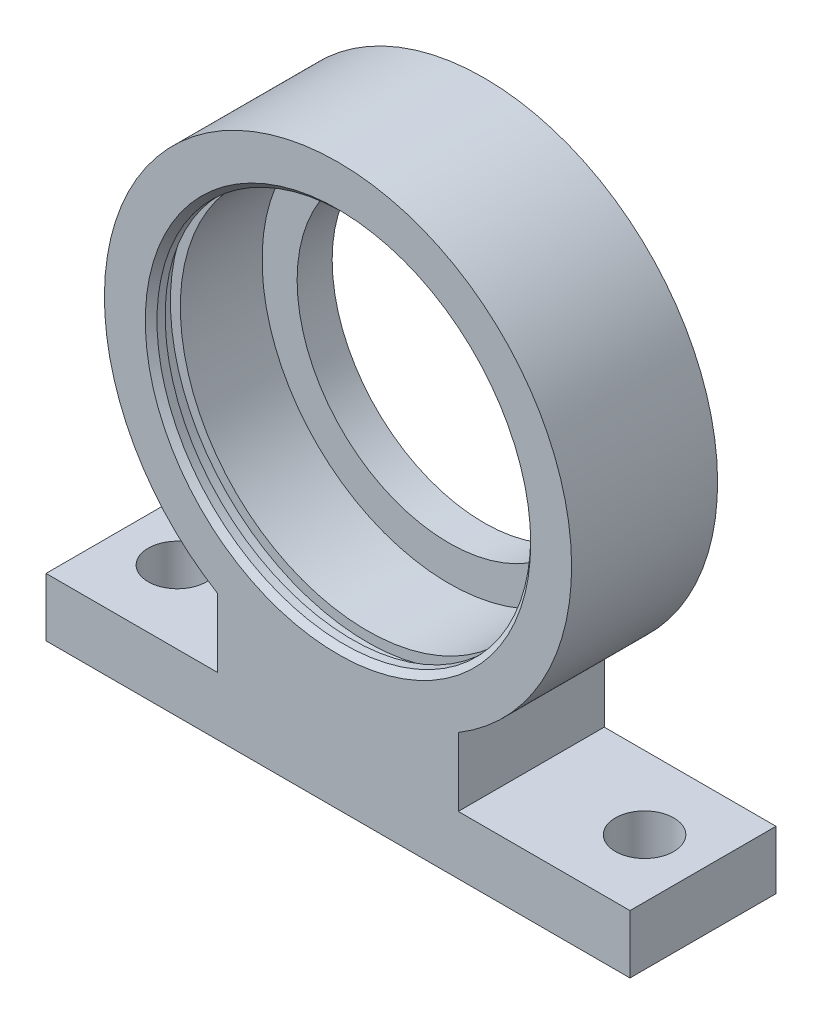
ISO-10303-21;
HEADER;
FILE_DESCRIPTION(('STEP AP214'),'2;1');
FILE_NAME('part.step','',(''),(''),'','','');
FILE_SCHEMA(('AUTOMOTIVE_DESIGN { 1 0 10303 214 1 1 1 1 }'));
ENDSEC;
DATA;
#1=APPLICATION_CONTEXT('core data for automotive mechanical design processes');
#2=APPLICATION_PROTOCOL_DEFINITION('international standard','automotive_design',2000,#1);
#3=PRODUCT_CONTEXT('',#1,'mechanical');
#4=PRODUCT('Part','Part','',(#3));
#5=PRODUCT_RELATED_PRODUCT_CATEGORY('part','',(#4));
#6=PRODUCT_DEFINITION_FORMATION('','',#4);
#7=PRODUCT_DEFINITION_CONTEXT('part definition',#1,'design');
#8=PRODUCT_DEFINITION('design','',#6,#7);
#9=PRODUCT_DEFINITION_SHAPE('','',#8);
#10=(LENGTH_UNIT() NAMED_UNIT(*) SI_UNIT(.MILLI.,.METRE.));
#11=(NAMED_UNIT(*) PLANE_ANGLE_UNIT() SI_UNIT($,.RADIAN.));
#12=(NAMED_UNIT(*) SI_UNIT($,.STERADIAN.) SOLID_ANGLE_UNIT());
#13=UNCERTAINTY_MEASURE_WITH_UNIT(LENGTH_MEASURE(1.E-05),#10,'distance_accuracy_value','');
#14=(GEOMETRIC_REPRESENTATION_CONTEXT(3) GLOBAL_UNCERTAINTY_ASSIGNED_CONTEXT((#13)) GLOBAL_UNIT_ASSIGNED_CONTEXT((#10,
#11,#12)) REPRESENTATION_CONTEXT('',''));
#15=CARTESIAN_POINT('',(0.,0.,0.));
#16=DIRECTION('',(0.,0.,1.));
#17=DIRECTION('',(1.,0.,0.));
#18=AXIS2_PLACEMENT_3D('',#15,#16,#17);
#19=CARTESIAN_POINT('',(0.,0.,12.5));
#20=DIRECTION('',(0.,0.,-1.));
#21=DIRECTION('',(-1.,0.,0.));
#22=AXIS2_PLACEMENT_3D('',#19,#20,#21);
#23=CYLINDRICAL_SURFACE('',#22,16.);
#24=CARTESIAN_POINT('',(0.,0.,3.));
#25=DIRECTION('',(0.,0.,1.));
#26=DIRECTION('',(1.,0.,0.));
#27=AXIS2_PLACEMENT_3D('',#24,#25,#26);
#28=CIRCLE('',#27,16.);
#29=CARTESIAN_POINT('',(16.,0.,3.));
#30=VERTEX_POINT('',#29);
#31=EDGE_CURVE('E165',#30,#30,#28,.T.);
#32=ORIENTED_EDGE('',*,*,#31,.F.);
#33=EDGE_LOOP('',(#32));
#34=FACE_BOUND('',#33,.T.);
#35=CARTESIAN_POINT('',(0.,0.,10.));
#36=DIRECTION('',(0.,0.,1.));
#37=DIRECTION('',(1.,0.,0.));
#38=AXIS2_PLACEMENT_3D('',#35,#36,#37);
#39=CIRCLE('',#38,16.);
#40=CARTESIAN_POINT('',(16.,0.,10.));
#41=VERTEX_POINT('',#40);
#42=EDGE_CURVE('E278',#41,#41,#39,.T.);
#43=ORIENTED_EDGE('',*,*,#42,.T.);
#44=EDGE_LOOP('',(#43));
#45=FACE_BOUND('',#44,.T.);
#46=ADVANCED_FACE('F35',(#34,#45),#23,.F.);
#47=CARTESIAN_POINT('',(0.,0.,12.5));
#48=DIRECTION('',(0.,0.,-1.));
#49=DIRECTION('',(-1.,0.,0.));
#50=AXIS2_PLACEMENT_3D('',#47,#48,#49);
#51=CYLINDRICAL_SURFACE('',#50,13.);
#52=CARTESIAN_POINT('',(0.,0.,0.));
#53=DIRECTION('',(0.,0.,1.));
#54=DIRECTION('',(1.,0.,0.));
#55=AXIS2_PLACEMENT_3D('',#52,#53,#54);
#56=CIRCLE('',#55,13.);
#57=CARTESIAN_POINT('',(13.,0.,0.));
#58=VERTEX_POINT('',#57);
#59=EDGE_CURVE('E137',#58,#58,#56,.T.);
#60=ORIENTED_EDGE('',*,*,#59,.F.);
#61=EDGE_LOOP('',(#60));
#62=FACE_BOUND('',#61,.T.);
#63=CARTESIAN_POINT('',(0.,0.,3.));
#64=DIRECTION('',(0.,0.,1.));
#65=DIRECTION('',(1.,0.,0.));
#66=AXIS2_PLACEMENT_3D('',#63,#64,#65);
#67=CIRCLE('',#66,13.);
#68=CARTESIAN_POINT('',(13.,0.,3.));
#69=VERTEX_POINT('',#68);
#70=EDGE_CURVE('E163',#69,#69,#67,.T.);
#71=ORIENTED_EDGE('',*,*,#70,.T.);
#72=EDGE_LOOP('',(#71));
#73=FACE_BOUND('',#72,.T.);
#74=ADVANCED_FACE('F183',(#62,#73),#51,.F.);
#75=CARTESIAN_POINT('',(0.,0.,12.5));
#76=DIRECTION('',(0.,0.,1.));
#77=DIRECTION('',(1.,0.,0.));
#78=AXIS2_PLACEMENT_3D('',#75,#76,#77);
#79=PLANE('',#78);
#80=CARTESIAN_POINT('',(0.,0.,12.5));
#81=DIRECTION('',(0.,0.,1.));
#82=DIRECTION('',(1.,0.,0.));
#83=AXIS2_PLACEMENT_3D('',#80,#81,#82);
#84=CIRCLE('',#83,16.5);
#85=CARTESIAN_POINT('',(16.5,0.,12.5));
#86=VERTEX_POINT('',#85);
#87=EDGE_CURVE('E11',#86,#86,#84,.F.);
#88=ORIENTED_EDGE('',*,*,#87,.T.);
#89=EDGE_LOOP('',(#88));
#90=FACE_BOUND('',#89,.T.);
#91=DIRECTION('',(0.,1.,0.));
#92=VECTOR('',#91,1.);
#93=CARTESIAN_POINT('',(25.,-28.,12.5));
#94=LINE('',#93,#92);
#95=CARTESIAN_POINT('',(25.,-28.,12.5));
#96=VERTEX_POINT('',#95);
#97=CARTESIAN_POINT('',(25.,-23.,12.5));
#98=VERTEX_POINT('',#97);
#99=EDGE_CURVE('E148',#96,#98,#94,.T.);
#100=ORIENTED_EDGE('',*,*,#99,.T.);
#101=DIRECTION('',(-1.,0.,0.));
#102=VECTOR('',#101,1.);
#103=CARTESIAN_POINT('',(25.,-23.,12.5));
#104=LINE('',#103,#102);
#105=CARTESIAN_POINT('',(10.2978420208395,-23.,12.5));
#106=VERTEX_POINT('',#105);
#107=EDGE_CURVE('E96',#98,#106,#104,.T.);
#108=ORIENTED_EDGE('',*,*,#107,.T.);
#109=DIRECTION('',(0.,1.,0.));
#110=VECTOR('',#109,1.);
#111=CARTESIAN_POINT('',(10.2978420208395,-23.,12.5));
#112=LINE('',#111,#110);
#113=CARTESIAN_POINT('',(10.2978420208395,-17.1450998747115,12.5));
#114=VERTEX_POINT('',#113);
#115=EDGE_CURVE('E248',#106,#114,#112,.T.);
#116=ORIENTED_EDGE('',*,*,#115,.T.);
#117=CARTESIAN_POINT('',(0.,0.,12.5));
#118=DIRECTION('',(0.,0.,1.));
#119=DIRECTION('',(1.,0.,0.));
#120=AXIS2_PLACEMENT_3D('',#117,#118,#119);
#121=CIRCLE('',#120,20.);
#122=CARTESIAN_POINT('',(-10.2978420208395,-17.1450998747115,12.5));
#123=VERTEX_POINT('',#122);
#124=EDGE_CURVE('E250',#114,#123,#121,.T.);
#125=ORIENTED_EDGE('',*,*,#124,.T.);
#126=DIRECTION('',(0.,-1.,0.));
#127=VECTOR('',#126,1.);
#128=CARTESIAN_POINT('',(-10.2978420208395,-23.,12.5));
#129=LINE('',#128,#127);
#130=CARTESIAN_POINT('',(-10.2978420208395,-23.,12.5));
#131=VERTEX_POINT('',#130);
#132=EDGE_CURVE('E115',#123,#131,#129,.T.);
#133=ORIENTED_EDGE('',*,*,#132,.T.);
#134=DIRECTION('',(-1.,0.,0.));
#135=VECTOR('',#134,1.);
#136=CARTESIAN_POINT('',(-25.,-23.,12.5));
#137=LINE('',#136,#135);
#138=CARTESIAN_POINT('',(-25.,-23.,12.5));
#139=VERTEX_POINT('',#138);
#140=EDGE_CURVE('E109',#131,#139,#137,.T.);
#141=ORIENTED_EDGE('',*,*,#140,.T.);
#142=DIRECTION('',(0.,-1.,0.));
#143=VECTOR('',#142,1.);
#144=CARTESIAN_POINT('',(-25.,-28.,12.5));
#145=LINE('',#144,#143);
#146=CARTESIAN_POINT('',(-25.,-28.,12.5));
#147=VERTEX_POINT('',#146);
#148=EDGE_CURVE('E113',#139,#147,#145,.T.);
#149=ORIENTED_EDGE('',*,*,#148,.T.);
#150=DIRECTION('',(1.,0.,0.));
#151=VECTOR('',#150,1.);
#152=CARTESIAN_POINT('',(25.,-28.,12.5));
#153=LINE('',#152,#151);
#154=EDGE_CURVE('E52',#147,#96,#153,.T.);
#155=ORIENTED_EDGE('',*,*,#154,.T.);
#156=EDGE_LOOP('',(#100,#108,#116,#125,#133,#141,#149,#155));
#157=FACE_BOUND('',#156,.T.);
#158=ADVANCED_FACE('F111',(#90,#157),#79,.T.);
#159=CARTESIAN_POINT('',(0.,0.,0.));
#160=DIRECTION('',(0.,0.,1.));
#161=DIRECTION('',(1.,0.,0.));
#162=AXIS2_PLACEMENT_3D('',#159,#160,#161);
#163=PLANE('',#162);
#164=DIRECTION('',(0.,1.,0.));
#165=VECTOR('',#164,1.);
#166=CARTESIAN_POINT('',(25.,-28.,0.));
#167=LINE('',#166,#165);
#168=CARTESIAN_POINT('',(25.,-28.,0.));
#169=VERTEX_POINT('',#168);
#170=CARTESIAN_POINT('',(25.,-23.,0.));
#171=VERTEX_POINT('',#170);
#172=EDGE_CURVE('E133',#169,#171,#167,.T.);
#173=ORIENTED_EDGE('',*,*,#172,.F.);
#174=DIRECTION('',(1.,0.,0.));
#175=VECTOR('',#174,1.);
#176=CARTESIAN_POINT('',(25.,-28.,0.));
#177=LINE('',#176,#175);
#178=CARTESIAN_POINT('',(-25.,-28.,0.));
#179=VERTEX_POINT('',#178);
#180=EDGE_CURVE('E87',#179,#169,#177,.T.);
#181=ORIENTED_EDGE('',*,*,#180,.F.);
#182=DIRECTION('',(0.,-1.,0.));
#183=VECTOR('',#182,1.);
#184=CARTESIAN_POINT('',(-25.,-28.,0.));
#185=LINE('',#184,#183);
#186=CARTESIAN_POINT('',(-25.,-23.,0.));
#187=VERTEX_POINT('',#186);
#188=EDGE_CURVE('E81',#187,#179,#185,.T.);
#189=ORIENTED_EDGE('',*,*,#188,.F.);
#190=DIRECTION('',(-1.,0.,0.));
#191=VECTOR('',#190,1.);
#192=CARTESIAN_POINT('',(-25.,-23.,0.));
#193=LINE('',#192,#191);
#194=CARTESIAN_POINT('',(-10.2978420208395,-23.,0.));
#195=VERTEX_POINT('',#194);
#196=EDGE_CURVE('E123',#195,#187,#193,.T.);
#197=ORIENTED_EDGE('',*,*,#196,.F.);
#198=DIRECTION('',(0.,-1.,0.));
#199=VECTOR('',#198,1.);
#200=CARTESIAN_POINT('',(-10.2978420208395,-23.,0.));
#201=LINE('',#200,#199);
#202=CARTESIAN_POINT('',(-10.2978420208395,-17.1450998747115,0.));
#203=VERTEX_POINT('',#202);
#204=EDGE_CURVE('E143',#203,#195,#201,.T.);
#205=ORIENTED_EDGE('',*,*,#204,.F.);
#206=CARTESIAN_POINT('',(0.,0.,0.));
#207=DIRECTION('',(0.,0.,1.));
#208=DIRECTION('',(1.,0.,0.));
#209=AXIS2_PLACEMENT_3D('',#206,#207,#208);
#210=CIRCLE('',#209,20.);
#211=CARTESIAN_POINT('',(10.2978420208395,-17.1450998747115,0.));
#212=VERTEX_POINT('',#211);
#213=EDGE_CURVE('E141',#212,#203,#210,.T.);
#214=ORIENTED_EDGE('',*,*,#213,.F.);
#215=DIRECTION('',(0.,1.,0.));
#216=VECTOR('',#215,1.);
#217=CARTESIAN_POINT('',(10.2978420208395,-23.,0.));
#218=LINE('',#217,#216);
#219=CARTESIAN_POINT('',(10.2978420208395,-23.,0.));
#220=VERTEX_POINT('',#219);
#221=EDGE_CURVE('E139',#220,#212,#218,.T.);
#222=ORIENTED_EDGE('',*,*,#221,.F.);
#223=DIRECTION('',(-1.,0.,0.));
#224=VECTOR('',#223,1.);
#225=CARTESIAN_POINT('',(25.,-23.,0.));
#226=LINE('',#225,#224);
#227=EDGE_CURVE('E136',#171,#220,#226,.T.);
#228=ORIENTED_EDGE('',*,*,#227,.F.);
#229=EDGE_LOOP('',(#173,#181,#189,#197,#205,#214,#222,#228));
#230=FACE_BOUND('',#229,.T.);
#231=ORIENTED_EDGE('',*,*,#59,.T.);
#232=EDGE_LOOP('',(#231));
#233=FACE_BOUND('',#232,.T.);
#234=ADVANCED_FACE('F212',(#230,#233),#163,.F.);
#235=CARTESIAN_POINT('',(25.,-28.,12.5));
#236=DIRECTION('',(-1.,0.,0.));
#237=DIRECTION('',(0.,-1.,0.));
#238=AXIS2_PLACEMENT_3D('',#235,#236,#237);
#239=PLANE('',#238);
#240=ORIENTED_EDGE('',*,*,#172,.T.);
#241=DIRECTION('',(0.,0.,-1.));
#242=VECTOR('',#241,1.);
#243=CARTESIAN_POINT('',(25.,-23.,12.5));
#244=LINE('',#243,#242);
#245=EDGE_CURVE('E161',#98,#171,#244,.T.);
#246=ORIENTED_EDGE('',*,*,#245,.F.);
#247=ORIENTED_EDGE('',*,*,#99,.F.);
#248=DIRECTION('',(0.,0.,-1.));
#249=VECTOR('',#248,1.);
#250=CARTESIAN_POINT('',(25.,-28.,12.5));
#251=LINE('',#250,#249);
#252=EDGE_CURVE('E129',#96,#169,#251,.T.);
#253=ORIENTED_EDGE('',*,*,#252,.T.);
#254=EDGE_LOOP('',(#240,#246,#247,#253));
#255=FACE_BOUND('',#254,.T.);
#256=ADVANCED_FACE('F232',(#255),#239,.F.);
#257=CARTESIAN_POINT('',(25.,-23.,12.5));
#258=DIRECTION('',(0.,-1.,0.));
#259=DIRECTION('',(1.,0.,0.));
#260=AXIS2_PLACEMENT_3D('',#257,#258,#259);
#261=PLANE('',#260);
#262=CARTESIAN_POINT('',(20.,-23.,6.25));
#263=DIRECTION('',(0.,1.,0.));
#264=DIRECTION('',(1.,0.,0.));
#265=AXIS2_PLACEMENT_3D('',#262,#263,#264);
#266=CIRCLE('',#265,2.5);
#267=CARTESIAN_POINT('',(17.5,-23.,6.25));
#268=VERTEX_POINT('',#267);
#269=EDGE_CURVE('E261',#268,#268,#266,.T.);
#270=ORIENTED_EDGE('',*,*,#269,.F.);
#271=EDGE_LOOP('',(#270));
#272=FACE_BOUND('',#271,.T.);
#273=ORIENTED_EDGE('',*,*,#227,.T.);
#274=DIRECTION('',(0.,0.,-1.));
#275=VECTOR('',#274,1.);
#276=CARTESIAN_POINT('',(10.2978420208395,-23.,12.5));
#277=LINE('',#276,#275);
#278=EDGE_CURVE('E158',#106,#220,#277,.T.);
#279=ORIENTED_EDGE('',*,*,#278,.F.);
#280=ORIENTED_EDGE('',*,*,#107,.F.);
#281=ORIENTED_EDGE('',*,*,#245,.T.);
#282=EDGE_LOOP('',(#273,#279,#280,#281));
#283=FACE_BOUND('',#282,.T.);
#284=ADVANCED_FACE('F229',(#272,#283),#261,.F.);
#285=CARTESIAN_POINT('',(10.2978420208395,-23.,12.5));
#286=DIRECTION('',(-1.,0.,0.));
#287=DIRECTION('',(0.,0.,1.));
#288=AXIS2_PLACEMENT_3D('',#285,#286,#287);
#289=PLANE('',#288);
#290=ORIENTED_EDGE('',*,*,#221,.T.);
#291=DIRECTION('',(0.,0.,-1.));
#292=VECTOR('',#291,1.);
#293=CARTESIAN_POINT('',(10.2978420208395,-17.1450998747115,12.5));
#294=LINE('',#293,#292);
#295=EDGE_CURVE('E155',#114,#212,#294,.T.);
#296=ORIENTED_EDGE('',*,*,#295,.F.);
#297=ORIENTED_EDGE('',*,*,#115,.F.);
#298=ORIENTED_EDGE('',*,*,#278,.T.);
#299=EDGE_LOOP('',(#290,#296,#297,#298));
#300=FACE_BOUND('',#299,.T.);
#301=ADVANCED_FACE('F225',(#300),#289,.F.);
#302=CARTESIAN_POINT('',(0.,0.,12.5));
#303=DIRECTION('',(0.,0.,-1.));
#304=DIRECTION('',(-1.,0.,0.));
#305=AXIS2_PLACEMENT_3D('',#302,#303,#304);
#306=CYLINDRICAL_SURFACE('',#305,20.);
#307=ORIENTED_EDGE('',*,*,#213,.T.);
#308=DIRECTION('',(0.,0.,-1.));
#309=VECTOR('',#308,1.);
#310=CARTESIAN_POINT('',(-10.2978420208395,-17.1450998747115,12.5));
#311=LINE('',#310,#309);
#312=EDGE_CURVE('E152',#123,#203,#311,.T.);
#313=ORIENTED_EDGE('',*,*,#312,.F.);
#314=ORIENTED_EDGE('',*,*,#124,.F.);
#315=ORIENTED_EDGE('',*,*,#295,.T.);
#316=EDGE_LOOP('',(#307,#313,#314,#315));
#317=FACE_BOUND('',#316,.T.);
#318=ADVANCED_FACE('F221',(#317),#306,.T.);
#319=CARTESIAN_POINT('',(-10.2978420208395,-23.,12.5));
#320=DIRECTION('',(1.,0.,0.));
#321=DIRECTION('',(0.,1.,0.));
#322=AXIS2_PLACEMENT_3D('',#319,#320,#321);
#323=PLANE('',#322);
#324=ORIENTED_EDGE('',*,*,#204,.T.);
#325=DIRECTION('',(0.,0.,-1.));
#326=VECTOR('',#325,1.);
#327=CARTESIAN_POINT('',(-10.2978420208395,-23.,12.5));
#328=LINE('',#327,#326);
#329=EDGE_CURVE('E124',#131,#195,#328,.T.);
#330=ORIENTED_EDGE('',*,*,#329,.F.);
#331=ORIENTED_EDGE('',*,*,#132,.F.);
#332=ORIENTED_EDGE('',*,*,#312,.T.);
#333=EDGE_LOOP('',(#324,#330,#331,#332));
#334=FACE_BOUND('',#333,.T.);
#335=ADVANCED_FACE('F217',(#334),#323,.F.);
#336=CARTESIAN_POINT('',(-25.,-23.,12.5));
#337=DIRECTION('',(0.,-1.,0.));
#338=DIRECTION('',(1.,0.,0.));
#339=AXIS2_PLACEMENT_3D('',#336,#337,#338);
#340=PLANE('',#339);
#341=CARTESIAN_POINT('',(-20.,-23.,6.25));
#342=DIRECTION('',(0.,1.,0.));
#343=DIRECTION('',(-1.,0.,0.));
#344=AXIS2_PLACEMENT_3D('',#341,#342,#343);
#345=CIRCLE('',#344,2.5);
#346=CARTESIAN_POINT('',(-22.5,-23.,6.25));
#347=VERTEX_POINT('',#346);
#348=EDGE_CURVE('E268',#347,#347,#345,.T.);
#349=ORIENTED_EDGE('',*,*,#348,.F.);
#350=EDGE_LOOP('',(#349));
#351=FACE_BOUND('',#350,.T.);
#352=ORIENTED_EDGE('',*,*,#196,.T.);
#353=DIRECTION('',(0.,0.,-1.));
#354=VECTOR('',#353,1.);
#355=CARTESIAN_POINT('',(-25.,-23.,12.5));
#356=LINE('',#355,#354);
#357=EDGE_CURVE('E120',#139,#187,#356,.T.);
#358=ORIENTED_EDGE('',*,*,#357,.F.);
#359=ORIENTED_EDGE('',*,*,#140,.F.);
#360=ORIENTED_EDGE('',*,*,#329,.T.);
#361=EDGE_LOOP('',(#352,#358,#359,#360));
#362=FACE_BOUND('',#361,.T.);
#363=ADVANCED_FACE('F121',(#351,#362),#340,.F.);
#364=CARTESIAN_POINT('',(-25.,-28.,12.5));
#365=DIRECTION('',(1.,0.,0.));
#366=DIRECTION('',(0.,1.,0.));
#367=AXIS2_PLACEMENT_3D('',#364,#365,#366);
#368=PLANE('',#367);
#369=ORIENTED_EDGE('',*,*,#188,.T.);
#370=DIRECTION('',(0.,0.,-1.));
#371=VECTOR('',#370,1.);
#372=CARTESIAN_POINT('',(-25.,-28.,12.5));
#373=LINE('',#372,#371);
#374=EDGE_CURVE('E125',#147,#179,#373,.T.);
#375=ORIENTED_EDGE('',*,*,#374,.F.);
#376=ORIENTED_EDGE('',*,*,#148,.F.);
#377=ORIENTED_EDGE('',*,*,#357,.T.);
#378=EDGE_LOOP('',(#369,#375,#376,#377));
#379=FACE_BOUND('',#378,.T.);
#380=ADVANCED_FACE('F127',(#379),#368,.F.);
#381=CARTESIAN_POINT('',(25.,-28.,12.5));
#382=DIRECTION('',(0.,1.,0.));
#383=DIRECTION('',(-1.,0.,0.));
#384=AXIS2_PLACEMENT_3D('',#381,#382,#383);
#385=PLANE('',#384);
#386=CARTESIAN_POINT('',(-20.,-28.,6.25));
#387=DIRECTION('',(0.,1.,0.));
#388=DIRECTION('',(-1.,0.,0.));
#389=AXIS2_PLACEMENT_3D('',#386,#387,#388);
#390=CIRCLE('',#389,2.5);
#391=CARTESIAN_POINT('',(-22.5,-28.,6.25));
#392=VERTEX_POINT('',#391);
#393=EDGE_CURVE('E260',#392,#392,#390,.T.);
#394=ORIENTED_EDGE('',*,*,#393,.T.);
#395=EDGE_LOOP('',(#394));
#396=FACE_BOUND('',#395,.T.);
#397=CARTESIAN_POINT('',(20.,-28.,6.25));
#398=DIRECTION('',(0.,1.,0.));
#399=DIRECTION('',(1.,0.,0.));
#400=AXIS2_PLACEMENT_3D('',#397,#398,#399);
#401=CIRCLE('',#400,2.5);
#402=CARTESIAN_POINT('',(17.5,-28.,6.25));
#403=VERTEX_POINT('',#402);
#404=EDGE_CURVE('E264',#403,#403,#401,.T.);
#405=ORIENTED_EDGE('',*,*,#404,.T.);
#406=EDGE_LOOP('',(#405));
#407=FACE_BOUND('',#406,.T.);
#408=ORIENTED_EDGE('',*,*,#180,.T.);
#409=ORIENTED_EDGE('',*,*,#252,.F.);
#410=ORIENTED_EDGE('',*,*,#154,.F.);
#411=ORIENTED_EDGE('',*,*,#374,.T.);
#412=EDGE_LOOP('',(#408,#409,#410,#411));
#413=FACE_BOUND('',#412,.T.);
#414=ADVANCED_FACE('F196',(#396,#407,#413),#385,.F.);
#415=CARTESIAN_POINT('',(0.,0.,12.));
#416=DIRECTION('',(0.,0.,1.));
#417=DIRECTION('',(1.,0.,0.));
#418=AXIS2_PLACEMENT_3D('',#415,#416,#417);
#419=CIRCLE('',#418,16.);
#420=CARTESIAN_POINT('',(16.,0.,12.));
#421=VERTEX_POINT('',#420);
#422=EDGE_CURVE('E44',#421,#421,#419,.T.);
#423=ORIENTED_EDGE('',*,*,#422,.T.);
#424=EDGE_LOOP('',(#423));
#425=FACE_BOUND('',#424,.T.);
#426=CARTESIAN_POINT('',(0.,0.,11.3));
#427=DIRECTION('',(0.,0.,1.));
#428=DIRECTION('',(1.,0.,0.));
#429=AXIS2_PLACEMENT_3D('',#426,#427,#428);
#430=CIRCLE('',#429,16.);
#431=CARTESIAN_POINT('',(16.,0.,11.3));
#432=VERTEX_POINT('',#431);
#433=EDGE_CURVE('E275',#432,#432,#430,.T.);
#434=ORIENTED_EDGE('',*,*,#433,.F.);
#435=EDGE_LOOP('',(#434));
#436=FACE_BOUND('',#435,.T.);
#437=ADVANCED_FACE('F169',(#425,#436),#23,.F.);
#438=CARTESIAN_POINT('',(0.,0.,3.));
#439=DIRECTION('',(0.,0.,1.));
#440=DIRECTION('',(1.,0.,0.));
#441=AXIS2_PLACEMENT_3D('',#438,#439,#440);
#442=PLANE('',#441);
#443=ORIENTED_EDGE('',*,*,#70,.F.);
#444=EDGE_LOOP('',(#443));
#445=FACE_BOUND('',#444,.T.);
#446=ORIENTED_EDGE('',*,*,#31,.T.);
#447=EDGE_LOOP('',(#446));
#448=FACE_BOUND('',#447,.T.);
#449=ADVANCED_FACE('F195',(#445,#448),#442,.T.);
#450=CARTESIAN_POINT('',(20.,-28.,6.25));
#451=DIRECTION('',(0.,1.,0.));
#452=DIRECTION('',(-1.,0.,0.));
#453=AXIS2_PLACEMENT_3D('',#450,#451,#452);
#454=CYLINDRICAL_SURFACE('',#453,2.5);
#455=CARTESIAN_POINT('',(17.5,-28.,6.25));
#456=CARTESIAN_POINT('',(17.5,-27.9479166666667,6.25));
#457=CARTESIAN_POINT('',(17.5,-27.8958333333333,6.25));
#458=CARTESIAN_POINT('',(17.5,-27.7916666666667,6.25));
#459=CARTESIAN_POINT('',(17.5,-27.7395833333333,6.25));
#460=CARTESIAN_POINT('',(17.5,-27.6354166666667,6.25));
#461=CARTESIAN_POINT('',(17.5,-27.5833333333333,6.25));
#462=CARTESIAN_POINT('',(17.5,-27.4791666666667,6.25));
#463=CARTESIAN_POINT('',(17.5,-27.4270833333333,6.25));
#464=CARTESIAN_POINT('',(17.5,-27.3229166666667,6.25));
#465=CARTESIAN_POINT('',(17.5,-27.2708333333333,6.25));
#466=CARTESIAN_POINT('',(17.5,-27.1666666666667,6.25));
#467=CARTESIAN_POINT('',(17.5,-27.1145833333333,6.25));
#468=CARTESIAN_POINT('',(17.5,-27.0104166666667,6.25));
#469=CARTESIAN_POINT('',(17.5,-26.9583333333333,6.25));
#470=CARTESIAN_POINT('',(17.5,-26.8541666666667,6.25));
#471=CARTESIAN_POINT('',(17.5,-26.8020833333333,6.25));
#472=CARTESIAN_POINT('',(17.5,-26.6979166666667,6.25));
#473=CARTESIAN_POINT('',(17.5,-26.6458333333333,6.25));
#474=CARTESIAN_POINT('',(17.5,-26.5416666666667,6.25));
#475=CARTESIAN_POINT('',(17.5,-26.4895833333333,6.25));
#476=CARTESIAN_POINT('',(17.5,-26.3854166666667,6.25));
#477=CARTESIAN_POINT('',(17.5,-26.3333333333333,6.25));
#478=CARTESIAN_POINT('',(17.5,-26.2291666666667,6.25));
#479=CARTESIAN_POINT('',(17.5,-26.1770833333333,6.25));
#480=CARTESIAN_POINT('',(17.5,-26.0729166666667,6.25));
#481=CARTESIAN_POINT('',(17.5,-26.0208333333333,6.25));
#482=CARTESIAN_POINT('',(17.5,-25.9166666666667,6.25));
#483=CARTESIAN_POINT('',(17.5,-25.8645833333333,6.25));
#484=CARTESIAN_POINT('',(17.5,-25.7604166666667,6.25));
#485=CARTESIAN_POINT('',(17.5,-25.7083333333333,6.25));
#486=CARTESIAN_POINT('',(17.5,-25.6041666666667,6.25));
#487=CARTESIAN_POINT('',(17.5,-25.5520833333333,6.25));
#488=CARTESIAN_POINT('',(17.5,-25.4479166666667,6.25));
#489=CARTESIAN_POINT('',(17.5,-25.3958333333333,6.25));
#490=CARTESIAN_POINT('',(17.5,-25.2916666666667,6.25));
#491=CARTESIAN_POINT('',(17.5,-25.2395833333333,6.25));
#492=CARTESIAN_POINT('',(17.5,-25.1354166666667,6.25));
#493=CARTESIAN_POINT('',(17.5,-25.0833333333333,6.25));
#494=CARTESIAN_POINT('',(17.5,-24.9791666666667,6.25));
#495=CARTESIAN_POINT('',(17.5,-24.9270833333333,6.25));
#496=CARTESIAN_POINT('',(17.5,-24.8229166666667,6.25));
#497=CARTESIAN_POINT('',(17.5,-24.7708333333333,6.25));
#498=CARTESIAN_POINT('',(17.5,-24.6666666666667,6.25));
#499=CARTESIAN_POINT('',(17.5,-24.6145833333333,6.25));
#500=CARTESIAN_POINT('',(17.5,-24.5104166666667,6.25));
#501=CARTESIAN_POINT('',(17.5,-24.4583333333333,6.25));
#502=CARTESIAN_POINT('',(17.5,-24.3541666666667,6.25));
#503=CARTESIAN_POINT('',(17.5,-24.3020833333333,6.25));
#504=CARTESIAN_POINT('',(17.5,-24.1979166666667,6.25));
#505=CARTESIAN_POINT('',(17.5,-24.1458333333333,6.25));
#506=CARTESIAN_POINT('',(17.5,-24.0416666666667,6.25));
#507=CARTESIAN_POINT('',(17.5,-23.9895833333333,6.25));
#508=CARTESIAN_POINT('',(17.5,-23.8854166666667,6.25));
#509=CARTESIAN_POINT('',(17.5,-23.8333333333333,6.25));
#510=CARTESIAN_POINT('',(17.5,-23.7291666666667,6.25));
#511=CARTESIAN_POINT('',(17.5,-23.6770833333333,6.25));
#512=CARTESIAN_POINT('',(17.5,-23.5729166666667,6.25));
#513=CARTESIAN_POINT('',(17.5,-23.5208333333333,6.25));
#514=CARTESIAN_POINT('',(17.5,-23.4166666666667,6.25));
#515=CARTESIAN_POINT('',(17.5,-23.3645833333333,6.25));
#516=CARTESIAN_POINT('',(17.5,-23.2604166666667,6.25));
#517=CARTESIAN_POINT('',(17.5,-23.2083333333333,6.25));
#518=CARTESIAN_POINT('',(17.5,-23.1041666666667,6.25));
#519=CARTESIAN_POINT('',(17.5,-23.0520833333333,6.25));
#520=CARTESIAN_POINT('',(17.5,-23.,6.25));
#521=B_SPLINE_CURVE_WITH_KNOTS('',3,(#455,#456,#457,#458,#459,#460,#461,#462,#463,#464,#465,
#466,#467,#468,#469,#470,#471,#472,#473,#474,#475,#476,#477,#478,#479,#480,#481,#482,#483,#484,
#485,#486,#487,#488,#489,#490,#491,#492,#493,#494,#495,#496,#497,#498,#499,#500,#501,#502,#503,
#504,#505,#506,#507,#508,#509,#510,#511,#512,#513,#514,#515,#516,#517,#518,#519,#520),
.UNSPECIFIED.,.F.,.F.,(4,2,2,2,2,2,2,2,2,2,2,2,2,2,2,2,2,2,2,2,2,2,2,2,2,2,2,2,2,2,2,2,4),(0.,
0.15625,0.3125,0.46875,0.625000000000001,0.781250000000001,0.937500000000001,1.09375,1.25,
1.40625,1.5625,1.71875,1.875,2.03125,2.1875,2.34375,2.5,2.65625,2.8125,2.96875,3.125,3.28125,
3.4375,3.59375,3.75,3.90625,4.0625,4.21875,4.375,4.53125,4.6875,4.84375,5.),.UNSPECIFIED.);
#522=EDGE_CURVE('BSEAM201',#403,#268,#521,.T.);
#523=ORIENTED_EDGE('',*,*,#404,.F.);
#524=ORIENTED_EDGE('',*,*,#269,.T.);
#525=ORIENTED_EDGE('',*,*,#522,.T.);
#526=ORIENTED_EDGE('',*,*,#522,.F.);
#527=EDGE_LOOP('',(#523,#525,#524,#526));
#528=FACE_BOUND('',#527,.T.);
#529=ADVANCED_FACE('F201',(#528),#454,.F.);
#530=CARTESIAN_POINT('',(-20.,-28.,6.25));
#531=DIRECTION('',(0.,1.,0.));
#532=DIRECTION('',(-1.,0.,0.));
#533=AXIS2_PLACEMENT_3D('',#530,#531,#532);
#534=CYLINDRICAL_SURFACE('',#533,2.5);
#535=CARTESIAN_POINT('',(-22.5,-28.,6.25));
#536=CARTESIAN_POINT('',(-22.5,-27.9479166666667,6.25));
#537=CARTESIAN_POINT('',(-22.5,-27.8958333333333,6.25));
#538=CARTESIAN_POINT('',(-22.5,-27.7916666666667,6.25));
#539=CARTESIAN_POINT('',(-22.5,-27.7395833333333,6.25));
#540=CARTESIAN_POINT('',(-22.5,-27.6354166666667,6.25));
#541=CARTESIAN_POINT('',(-22.5,-27.5833333333333,6.25));
#542=CARTESIAN_POINT('',(-22.5,-27.4791666666667,6.25));
#543=CARTESIAN_POINT('',(-22.5,-27.4270833333333,6.25));
#544=CARTESIAN_POINT('',(-22.5,-27.3229166666667,6.25));
#545=CARTESIAN_POINT('',(-22.5,-27.2708333333333,6.25));
#546=CARTESIAN_POINT('',(-22.5,-27.1666666666667,6.25));
#547=CARTESIAN_POINT('',(-22.5,-27.1145833333333,6.25));
#548=CARTESIAN_POINT('',(-22.5,-27.0104166666667,6.25));
#549=CARTESIAN_POINT('',(-22.5,-26.9583333333333,6.25));
#550=CARTESIAN_POINT('',(-22.5,-26.8541666666667,6.25));
#551=CARTESIAN_POINT('',(-22.5,-26.8020833333333,6.25));
#552=CARTESIAN_POINT('',(-22.5,-26.6979166666667,6.25));
#553=CARTESIAN_POINT('',(-22.5,-26.6458333333333,6.25));
#554=CARTESIAN_POINT('',(-22.5,-26.5416666666667,6.25));
#555=CARTESIAN_POINT('',(-22.5,-26.4895833333333,6.25));
#556=CARTESIAN_POINT('',(-22.5,-26.3854166666667,6.25));
#557=CARTESIAN_POINT('',(-22.5,-26.3333333333333,6.25));
#558=CARTESIAN_POINT('',(-22.5,-26.2291666666667,6.25));
#559=CARTESIAN_POINT('',(-22.5,-26.1770833333333,6.25));
#560=CARTESIAN_POINT('',(-22.5,-26.0729166666667,6.25));
#561=CARTESIAN_POINT('',(-22.5,-26.0208333333333,6.25));
#562=CARTESIAN_POINT('',(-22.5,-25.9166666666667,6.25));
#563=CARTESIAN_POINT('',(-22.5,-25.8645833333333,6.25));
#564=CARTESIAN_POINT('',(-22.5,-25.7604166666667,6.25));
#565=CARTESIAN_POINT('',(-22.5,-25.7083333333333,6.25));
#566=CARTESIAN_POINT('',(-22.5,-25.6041666666667,6.25));
#567=CARTESIAN_POINT('',(-22.5,-25.5520833333333,6.25));
#568=CARTESIAN_POINT('',(-22.5,-25.4479166666667,6.25));
#569=CARTESIAN_POINT('',(-22.5,-25.3958333333333,6.25));
#570=CARTESIAN_POINT('',(-22.5,-25.2916666666667,6.25));
#571=CARTESIAN_POINT('',(-22.5,-25.2395833333333,6.25));
#572=CARTESIAN_POINT('',(-22.5,-25.1354166666667,6.25));
#573=CARTESIAN_POINT('',(-22.5,-25.0833333333333,6.25));
#574=CARTESIAN_POINT('',(-22.5,-24.9791666666667,6.25));
#575=CARTESIAN_POINT('',(-22.5,-24.9270833333333,6.25));
#576=CARTESIAN_POINT('',(-22.5,-24.8229166666667,6.25));
#577=CARTESIAN_POINT('',(-22.5,-24.7708333333333,6.25));
#578=CARTESIAN_POINT('',(-22.5,-24.6666666666667,6.25));
#579=CARTESIAN_POINT('',(-22.5,-24.6145833333333,6.25));
#580=CARTESIAN_POINT('',(-22.5,-24.5104166666667,6.25));
#581=CARTESIAN_POINT('',(-22.5,-24.4583333333333,6.25));
#582=CARTESIAN_POINT('',(-22.5,-24.3541666666667,6.25));
#583=CARTESIAN_POINT('',(-22.5,-24.3020833333333,6.25));
#584=CARTESIAN_POINT('',(-22.5,-24.1979166666667,6.25));
#585=CARTESIAN_POINT('',(-22.5,-24.1458333333333,6.25));
#586=CARTESIAN_POINT('',(-22.5,-24.0416666666667,6.25));
#587=CARTESIAN_POINT('',(-22.5,-23.9895833333333,6.25));
#588=CARTESIAN_POINT('',(-22.5,-23.8854166666667,6.25));
#589=CARTESIAN_POINT('',(-22.5,-23.8333333333333,6.25));
#590=CARTESIAN_POINT('',(-22.5,-23.7291666666667,6.25));
#591=CARTESIAN_POINT('',(-22.5,-23.6770833333333,6.25));
#592=CARTESIAN_POINT('',(-22.5,-23.5729166666667,6.25));
#593=CARTESIAN_POINT('',(-22.5,-23.5208333333333,6.25));
#594=CARTESIAN_POINT('',(-22.5,-23.4166666666667,6.25));
#595=CARTESIAN_POINT('',(-22.5,-23.3645833333333,6.25));
#596=CARTESIAN_POINT('',(-22.5,-23.2604166666667,6.25));
#597=CARTESIAN_POINT('',(-22.5,-23.2083333333333,6.25));
#598=CARTESIAN_POINT('',(-22.5,-23.1041666666667,6.25));
#599=CARTESIAN_POINT('',(-22.5,-23.0520833333333,6.25));
#600=CARTESIAN_POINT('',(-22.5,-23.,6.25));
#601=B_SPLINE_CURVE_WITH_KNOTS('',3,(#535,#536,#537,#538,#539,#540,#541,#542,#543,#544,#545,
#546,#547,#548,#549,#550,#551,#552,#553,#554,#555,#556,#557,#558,#559,#560,#561,#562,#563,#564,
#565,#566,#567,#568,#569,#570,#571,#572,#573,#574,#575,#576,#577,#578,#579,#580,#581,#582,#583,
#584,#585,#586,#587,#588,#589,#590,#591,#592,#593,#594,#595,#596,#597,#598,#599,#600),
.UNSPECIFIED.,.F.,.F.,(4,2,2,2,2,2,2,2,2,2,2,2,2,2,2,2,2,2,2,2,2,2,2,2,2,2,2,2,2,2,2,2,4),(0.,
0.15625,0.3125,0.46875,0.625000000000001,0.781250000000001,0.937500000000001,1.09375,1.25,
1.40625,1.5625,1.71875,1.875,2.03125,2.1875,2.34375,2.5,2.65625,2.8125,2.96875,3.125,3.28125,
3.4375,3.59375,3.75,3.90625,4.0625,4.21875,4.375,4.53125,4.6875,4.84375,5.),.UNSPECIFIED.);
#602=EDGE_CURVE('BSEAM286',#392,#347,#601,.T.);
#603=ORIENTED_EDGE('',*,*,#393,.F.);
#604=ORIENTED_EDGE('',*,*,#348,.T.);
#605=ORIENTED_EDGE('',*,*,#602,.T.);
#606=ORIENTED_EDGE('',*,*,#602,.F.);
#607=EDGE_LOOP('',(#603,#605,#604,#606));
#608=FACE_BOUND('',#607,.T.);
#609=ADVANCED_FACE('F286',(#608),#534,.F.);
#610=CARTESIAN_POINT('',(0.,0.,11.3));
#611=DIRECTION('',(0.,0.,1.));
#612=DIRECTION('',(1.,0.,0.));
#613=AXIS2_PLACEMENT_3D('',#610,#611,#612);
#614=PLANE('',#613);
#615=CARTESIAN_POINT('',(0.,0.,11.3));
#616=DIRECTION('',(0.,0.,1.));
#617=DIRECTION('',(1.,0.,0.));
#618=AXIS2_PLACEMENT_3D('',#615,#616,#617);
#619=CIRCLE('',#618,16.85);
#620=CARTESIAN_POINT('',(16.85,0.,11.3));
#621=VERTEX_POINT('',#620);
#622=EDGE_CURVE('E265',#621,#621,#619,.T.);
#623=ORIENTED_EDGE('',*,*,#622,.F.);
#624=EDGE_LOOP('',(#623));
#625=FACE_BOUND('',#624,.T.);
#626=ORIENTED_EDGE('',*,*,#433,.T.);
#627=EDGE_LOOP('',(#626));
#628=FACE_BOUND('',#627,.T.);
#629=ADVANCED_FACE('F284',(#625,#628),#614,.F.);
#630=CARTESIAN_POINT('',(0.,0.,10.));
#631=DIRECTION('',(0.,0.,1.));
#632=DIRECTION('',(1.,0.,0.));
#633=AXIS2_PLACEMENT_3D('',#630,#631,#632);
#634=PLANE('',#633);
#635=CARTESIAN_POINT('',(0.,0.,10.));
#636=DIRECTION('',(0.,0.,1.));
#637=DIRECTION('',(1.,0.,0.));
#638=AXIS2_PLACEMENT_3D('',#635,#636,#637);
#639=CIRCLE('',#638,16.85);
#640=CARTESIAN_POINT('',(16.85,0.,10.));
#641=VERTEX_POINT('',#640);
#642=EDGE_CURVE('E272',#641,#641,#639,.T.);
#643=ORIENTED_EDGE('',*,*,#642,.T.);
#644=EDGE_LOOP('',(#643));
#645=FACE_BOUND('',#644,.T.);
#646=ORIENTED_EDGE('',*,*,#42,.F.);
#647=EDGE_LOOP('',(#646));
#648=FACE_BOUND('',#647,.T.);
#649=ADVANCED_FACE('F178',(#645,#648),#634,.T.);
#650=CARTESIAN_POINT('',(0.,0.,11.3));
#651=DIRECTION('',(0.,0.,-1.));
#652=DIRECTION('',(-1.,0.,0.));
#653=AXIS2_PLACEMENT_3D('',#650,#651,#652);
#654=CYLINDRICAL_SURFACE('',#653,16.85);
#655=ORIENTED_EDGE('',*,*,#622,.T.);
#656=EDGE_LOOP('',(#655));
#657=FACE_BOUND('',#656,.T.);
#658=ORIENTED_EDGE('',*,*,#642,.F.);
#659=EDGE_LOOP('',(#658));
#660=FACE_BOUND('',#659,.T.);
#661=ADVANCED_FACE('F173',(#657,#660),#654,.F.);
#662=CARTESIAN_POINT('',(0.,0.,12.));
#663=DIRECTION('',(0.,0.,1.));
#664=DIRECTION('',(1.,0.,0.));
#665=AXIS2_PLACEMENT_3D('',#662,#663,#664);
#666=CONICAL_SURFACE('',#665,16.,0.785398163397455);
#667=ORIENTED_EDGE('',*,*,#87,.F.);
#668=EDGE_LOOP('',(#667));
#669=FACE_BOUND('',#668,.T.);
#670=ORIENTED_EDGE('',*,*,#422,.F.);
#671=EDGE_LOOP('',(#670));
#672=FACE_BOUND('',#671,.T.);
#673=ADVANCED_FACE('F37',(#669,#672),#666,.F.);
#674=CLOSED_SHELL('',(#46,#74,#158,#234,#256,#284,#301,#318,#335,#363,#380,#414,#437,#449,#529,
#609,#629,#649,#661,#673));
#675=MANIFOLD_SOLID_BREP('B2',#674);
#676=ADVANCED_BREP_SHAPE_REPRESENTATION('',(#18,#675),#14);
#677=SHAPE_DEFINITION_REPRESENTATION(#9,#676);
ENDSEC;
END-ISO-10303-21;
